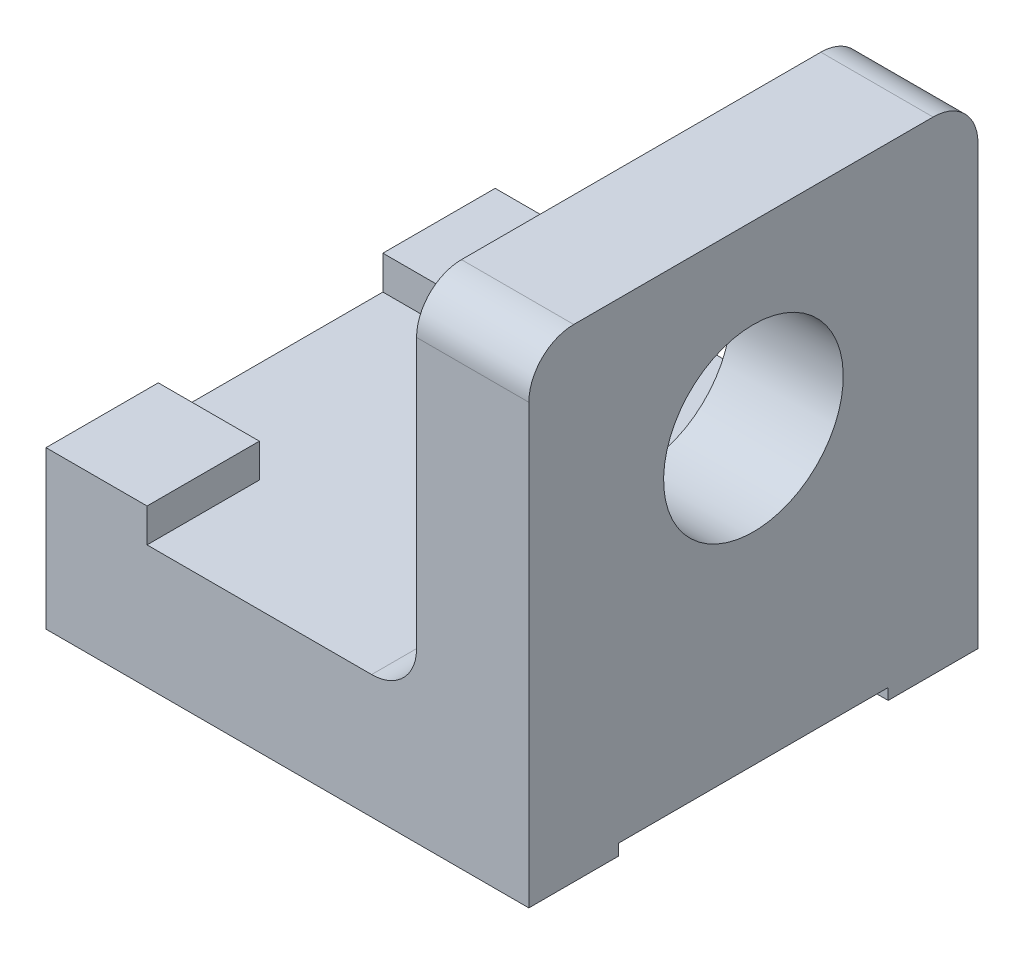
ISO-10303-21;
HEADER;
FILE_DESCRIPTION(('STEP AP214'),'2;1');
FILE_NAME('part.step','',(''),(''),'','','');
FILE_SCHEMA(('AUTOMOTIVE_DESIGN { 1 0 10303 214 1 1 1 1 }'));
ENDSEC;
DATA;
#1=APPLICATION_CONTEXT('core data for automotive mechanical design processes');
#2=APPLICATION_PROTOCOL_DEFINITION('international standard','automotive_design',2000,#1);
#3=PRODUCT_CONTEXT('',#1,'mechanical');
#4=PRODUCT('Part','Part','',(#3));
#5=PRODUCT_RELATED_PRODUCT_CATEGORY('part','',(#4));
#6=PRODUCT_DEFINITION_FORMATION('','',#4);
#7=PRODUCT_DEFINITION_CONTEXT('part definition',#1,'design');
#8=PRODUCT_DEFINITION('design','',#6,#7);
#9=PRODUCT_DEFINITION_SHAPE('','',#8);
#10=(LENGTH_UNIT() NAMED_UNIT(*) SI_UNIT(.MILLI.,.METRE.));
#11=(NAMED_UNIT(*) PLANE_ANGLE_UNIT() SI_UNIT($,.RADIAN.));
#12=(NAMED_UNIT(*) SI_UNIT($,.STERADIAN.) SOLID_ANGLE_UNIT());
#13=UNCERTAINTY_MEASURE_WITH_UNIT(LENGTH_MEASURE(1.E-05),#10,'distance_accuracy_value','');
#14=(GEOMETRIC_REPRESENTATION_CONTEXT(3) GLOBAL_UNCERTAINTY_ASSIGNED_CONTEXT((#13)) GLOBAL_UNIT_ASSIGNED_CONTEXT((#10,
#11,#12)) REPRESENTATION_CONTEXT('',''));
#15=CARTESIAN_POINT('',(0.,0.,0.));
#16=DIRECTION('',(0.,0.,1.));
#17=DIRECTION('',(1.,0.,0.));
#18=AXIS2_PLACEMENT_3D('',#15,#16,#17);
#19=CARTESIAN_POINT('',(88.34779045378,-23.8125,127.));
#20=DIRECTION('',(-1.,0.,0.));
#21=DIRECTION('',(0.,0.,1.));
#22=AXIS2_PLACEMENT_3D('',#19,#20,#21);
#23=PLANE('',#22);
#24=DIRECTION('',(0.,0.,-1.));
#25=VECTOR('',#24,1.);
#26=CARTESIAN_POINT('',(88.34779045378,-23.8125,127.));
#27=LINE('',#26,#25);
#28=CARTESIAN_POINT('',(88.34779045378,-23.8125,31.75));
#29=VERTEX_POINT('',#28);
#30=CARTESIAN_POINT('',(88.34779045378,-23.8125,0.));
#31=VERTEX_POINT('',#30);
#32=EDGE_CURVE('E329',#29,#31,#27,.T.);
#33=ORIENTED_EDGE('',*,*,#32,.F.);
#34=DIRECTION('',(0.,-1.,0.));
#35=VECTOR('',#34,1.);
#36=CARTESIAN_POINT('',(88.34779045378,-23.8125,31.75));
#37=LINE('',#36,#35);
#38=CARTESIAN_POINT('',(88.34779045378,-33.3374999999999,31.75));
#39=VERTEX_POINT('',#38);
#40=EDGE_CURVE('E216',#29,#39,#37,.T.);
#41=ORIENTED_EDGE('',*,*,#40,.T.);
#42=DIRECTION('',(0.,0.,-1.));
#43=VECTOR('',#42,1.);
#44=CARTESIAN_POINT('',(88.34779045378,-33.3374999999999,127.));
#45=LINE('',#44,#43);
#46=CARTESIAN_POINT('',(88.34779045378,-33.3374999999999,0.));
#47=VERTEX_POINT('',#46);
#48=EDGE_CURVE('E334',#39,#47,#45,.T.);
#49=ORIENTED_EDGE('',*,*,#48,.T.);
#50=DIRECTION('',(0.,1.,0.));
#51=VECTOR('',#50,1.);
#52=CARTESIAN_POINT('',(88.34779045378,-23.8125,0.));
#53=LINE('',#52,#51);
#54=EDGE_CURVE('E296',#47,#31,#53,.T.);
#55=ORIENTED_EDGE('',*,*,#54,.T.);
#56=EDGE_LOOP('',(#33,#41,#49,#55));
#57=FACE_BOUND('',#56,.T.);
#58=ADVANCED_FACE('F39',(#57),#23,.F.);
#59=CARTESIAN_POINT('',(59.7727904537801,-23.8125,127.));
#60=DIRECTION('',(0.,-1.,0.));
#61=DIRECTION('',(0.,0.,-1.));
#62=AXIS2_PLACEMENT_3D('',#59,#60,#61);
#63=PLANE('',#62);
#64=DIRECTION('',(0.,0.,-1.));
#65=VECTOR('',#64,1.);
#66=CARTESIAN_POINT('',(59.7727904537801,-23.8125,127.));
#67=LINE('',#66,#65);
#68=CARTESIAN_POINT('',(59.7727904537801,-23.8125,31.75));
#69=VERTEX_POINT('',#68);
#70=CARTESIAN_POINT('',(59.7727904537801,-23.8125,0.));
#71=VERTEX_POINT('',#70);
#72=EDGE_CURVE('E326',#69,#71,#67,.T.);
#73=ORIENTED_EDGE('',*,*,#72,.F.);
#74=DIRECTION('',(-1.,0.,0.));
#75=VECTOR('',#74,1.);
#76=CARTESIAN_POINT('',(109.81079045378,-23.8125,31.75));
#77=LINE('',#76,#75);
#78=EDGE_CURVE('E209',#29,#69,#77,.T.);
#79=ORIENTED_EDGE('',*,*,#78,.F.);
#80=ORIENTED_EDGE('',*,*,#32,.T.);
#81=DIRECTION('',(-1.,0.,0.));
#82=VECTOR('',#81,1.);
#83=CARTESIAN_POINT('',(59.7727904537801,-23.8125,0.));
#84=LINE('',#83,#82);
#85=EDGE_CURVE('E300',#31,#71,#84,.T.);
#86=ORIENTED_EDGE('',*,*,#85,.T.);
#87=EDGE_LOOP('',(#73,#79,#80,#86));
#88=FACE_BOUND('',#87,.T.);
#89=ADVANCED_FACE('F417',(#88),#63,.F.);
#90=CARTESIAN_POINT('',(196.29779045378,-68.2625,127.));
#91=DIRECTION('',(0.,1.,0.));
#92=DIRECTION('',(-1.,0.,0.));
#93=AXIS2_PLACEMENT_3D('',#90,#91,#92);
#94=PLANE('',#93);
#95=DIRECTION('',(0.,0.,-1.));
#96=VECTOR('',#95,1.);
#97=CARTESIAN_POINT('',(196.29779045378,-68.2625,127.));
#98=LINE('',#97,#96);
#99=CARTESIAN_POINT('',(196.29779045378,-68.2625,25.4));
#100=VERTEX_POINT('',#99);
#101=CARTESIAN_POINT('',(196.29779045378,-68.2625,0.));
#102=VERTEX_POINT('',#101);
#103=EDGE_CURVE('E316',#100,#102,#98,.T.);
#104=ORIENTED_EDGE('',*,*,#103,.F.);
#105=DIRECTION('',(-1.,0.,0.));
#106=VECTOR('',#105,1.);
#107=CARTESIAN_POINT('',(196.29779045378,-68.2625,25.4));
#108=LINE('',#107,#106);
#109=CARTESIAN_POINT('',(59.7727904537801,-68.2625,25.4));
#110=VERTEX_POINT('',#109);
#111=EDGE_CURVE('E234',#100,#110,#108,.T.);
#112=ORIENTED_EDGE('',*,*,#111,.T.);
#113=DIRECTION('',(0.,0.,-1.));
#114=VECTOR('',#113,1.);
#115=CARTESIAN_POINT('',(59.7727904537801,-68.2625,127.));
#116=LINE('',#115,#114);
#117=CARTESIAN_POINT('',(59.7727904537801,-68.2625,0.));
#118=VERTEX_POINT('',#117);
#119=EDGE_CURVE('E321',#110,#118,#116,.T.);
#120=ORIENTED_EDGE('',*,*,#119,.T.);
#121=DIRECTION('',(1.,0.,0.));
#122=VECTOR('',#121,1.);
#123=CARTESIAN_POINT('',(196.29779045378,-68.2625,0.));
#124=LINE('',#123,#122);
#125=EDGE_CURVE('E308',#118,#102,#124,.T.);
#126=ORIENTED_EDGE('',*,*,#125,.T.);
#127=EDGE_LOOP('',(#104,#112,#120,#126));
#128=FACE_BOUND('',#127,.T.);
#129=ADVANCED_FACE('F423',(#128),#94,.F.);
#130=CARTESIAN_POINT('',(196.29779045378,68.2625,127.));
#131=DIRECTION('',(0.,-1.,0.));
#132=DIRECTION('',(1.,0.,0.));
#133=AXIS2_PLACEMENT_3D('',#130,#131,#132);
#134=PLANE('',#133);
#135=DIRECTION('',(0.,0.,-1.));
#136=VECTOR('',#135,1.);
#137=CARTESIAN_POINT('',(164.54779045378,68.2625,127.));
#138=LINE('',#137,#136);
#139=CARTESIAN_POINT('',(164.54779045378,68.2625,114.3));
#140=VERTEX_POINT('',#139);
#141=CARTESIAN_POINT('',(164.54779045378,68.2625,12.7));
#142=VERTEX_POINT('',#141);
#143=EDGE_CURVE('E338',#140,#142,#138,.T.);
#144=ORIENTED_EDGE('',*,*,#143,.F.);
#145=DIRECTION('',(-1.,0.,0.));
#146=VECTOR('',#145,1.);
#147=CARTESIAN_POINT('',(196.29779045378,68.2625,114.3));
#148=LINE('',#147,#146);
#149=CARTESIAN_POINT('',(196.29779045378,68.2625,114.3));
#150=VERTEX_POINT('',#149);
#151=EDGE_CURVE('E363',#140,#150,#148,.F.);
#152=ORIENTED_EDGE('',*,*,#151,.T.);
#153=DIRECTION('',(0.,0.,-1.));
#154=VECTOR('',#153,1.);
#155=CARTESIAN_POINT('',(196.29779045378,68.2625,127.));
#156=LINE('',#155,#154);
#157=CARTESIAN_POINT('',(196.29779045378,68.2625,12.7));
#158=VERTEX_POINT('',#157);
#159=EDGE_CURVE('E289',#150,#158,#156,.T.);
#160=ORIENTED_EDGE('',*,*,#159,.T.);
#161=DIRECTION('',(-1.,0.,0.));
#162=VECTOR('',#161,1.);
#163=CARTESIAN_POINT('',(164.54779045378,68.2625,12.7));
#164=LINE('',#163,#162);
#165=EDGE_CURVE('E359',#158,#142,#164,.T.);
#166=ORIENTED_EDGE('',*,*,#165,.T.);
#167=EDGE_LOOP('',(#144,#152,#160,#166));
#168=FACE_BOUND('',#167,.T.);
#169=ADVANCED_FACE('F409',(#168),#134,.F.);
#170=CARTESIAN_POINT('',(164.54779045378,-33.3374999999999,127.));
#171=DIRECTION('',(1.,0.,0.));
#172=DIRECTION('',(0.,0.,-1.));
#173=AXIS2_PLACEMENT_3D('',#170,#171,#172);
#174=PLANE('',#173);
#175=CARTESIAN_POINT('',(164.54779045378,17.4625,63.5));
#176=DIRECTION('',(1.,0.,0.));
#177=DIRECTION('',(0.,0.,-1.));
#178=AXIS2_PLACEMENT_3D('',#175,#176,#177);
#179=CIRCLE('',#178,25.4);
#180=CARTESIAN_POINT('',(164.54779045378,17.4625,38.1));
#181=VERTEX_POINT('',#180);
#182=EDGE_CURVE('E260',#181,#181,#179,.T.);
#183=ORIENTED_EDGE('',*,*,#182,.T.);
#184=EDGE_LOOP('',(#183));
#185=FACE_BOUND('',#184,.T.);
#186=DIRECTION('',(0.,-1.,0.));
#187=VECTOR('',#186,1.);
#188=CARTESIAN_POINT('',(164.54779045378,-33.3374999999999,0.));
#189=LINE('',#188,#187);
#190=CARTESIAN_POINT('',(164.54779045378,55.5625,0.));
#191=VERTEX_POINT('',#190);
#192=CARTESIAN_POINT('',(164.54779045378,-20.6374999999999,0.));
#193=VERTEX_POINT('',#192);
#194=EDGE_CURVE('E264',#191,#193,#189,.T.);
#195=ORIENTED_EDGE('',*,*,#194,.T.);
#196=DIRECTION('',(0.,0.,-1.));
#197=VECTOR('',#196,1.);
#198=CARTESIAN_POINT('',(164.54779045378,-20.6374999999999,127.));
#199=LINE('',#198,#197);
#200=CARTESIAN_POINT('',(164.54779045378,-20.6374999999999,127.));
#201=VERTEX_POINT('',#200);
#202=EDGE_CURVE('E352',#193,#201,#199,.F.);
#203=ORIENTED_EDGE('',*,*,#202,.T.);
#204=DIRECTION('',(0.,-1.,0.));
#205=VECTOR('',#204,1.);
#206=CARTESIAN_POINT('',(164.54779045378,-33.3374999999999,127.));
#207=LINE('',#206,#205);
#208=CARTESIAN_POINT('',(164.54779045378,55.5625,127.));
#209=VERTEX_POINT('',#208);
#210=EDGE_CURVE('E265',#209,#201,#207,.T.);
#211=ORIENTED_EDGE('',*,*,#210,.F.);
#212=CARTESIAN_POINT('',(164.54779045378,55.5625,114.3));
#213=DIRECTION('',(1.,0.,0.));
#214=DIRECTION('',(0.,0.,-1.));
#215=AXIS2_PLACEMENT_3D('',#212,#213,#214);
#216=CIRCLE('',#215,12.7);
#217=EDGE_CURVE('E349',#209,#140,#216,.F.);
#218=ORIENTED_EDGE('',*,*,#217,.T.);
#219=ORIENTED_EDGE('',*,*,#143,.T.);
#220=CARTESIAN_POINT('',(164.54779045378,55.5625,12.7));
#221=DIRECTION('',(1.,0.,0.));
#222=DIRECTION('',(0.,0.,-1.));
#223=AXIS2_PLACEMENT_3D('',#220,#221,#222);
#224=CIRCLE('',#223,12.7);
#225=EDGE_CURVE('E346',#142,#191,#224,.F.);
#226=ORIENTED_EDGE('',*,*,#225,.T.);
#227=EDGE_LOOP('',(#195,#203,#211,#218,#219,#226));
#228=FACE_BOUND('',#227,.T.);
#229=ADVANCED_FACE('F380',(#185,#228),#174,.F.);
#230=CARTESIAN_POINT('',(88.34779045378,-33.3374999999999,127.));
#231=DIRECTION('',(0.,-1.,0.));
#232=DIRECTION('',(0.,0.,-1.));
#233=AXIS2_PLACEMENT_3D('',#230,#231,#232);
#234=PLANE('',#233);
#235=DIRECTION('',(-1.,0.,0.));
#236=VECTOR('',#235,1.);
#237=CARTESIAN_POINT('',(88.34779045378,-33.3374999999999,127.));
#238=LINE('',#237,#236);
#239=CARTESIAN_POINT('',(151.84779045378,-33.3374999999999,127.));
#240=VERTEX_POINT('',#239);
#241=CARTESIAN_POINT('',(88.34779045378,-33.3374999999999,127.));
#242=VERTEX_POINT('',#241);
#243=EDGE_CURVE('E269',#240,#242,#238,.T.);
#244=ORIENTED_EDGE('',*,*,#243,.F.);
#245=DIRECTION('',(0.,0.,-1.));
#246=VECTOR('',#245,1.);
#247=CARTESIAN_POINT('',(151.84779045378,-33.3374999999999,0.));
#248=LINE('',#247,#246);
#249=CARTESIAN_POINT('',(151.84779045378,-33.3374999999999,0.));
#250=VERTEX_POINT('',#249);
#251=EDGE_CURVE('E342',#240,#250,#248,.T.);
#252=ORIENTED_EDGE('',*,*,#251,.T.);
#253=DIRECTION('',(-1.,0.,0.));
#254=VECTOR('',#253,1.);
#255=CARTESIAN_POINT('',(88.34779045378,-33.3374999999999,0.));
#256=LINE('',#255,#254);
#257=EDGE_CURVE('E293',#250,#47,#256,.T.);
#258=ORIENTED_EDGE('',*,*,#257,.T.);
#259=ORIENTED_EDGE('',*,*,#48,.F.);
#260=DIRECTION('',(-1.,0.,0.));
#261=VECTOR('',#260,1.);
#262=CARTESIAN_POINT('',(109.81079045378,-33.3374999999999,31.75));
#263=LINE('',#262,#261);
#264=CARTESIAN_POINT('',(59.7727904537801,-33.3374999999999,31.75));
#265=VERTEX_POINT('',#264);
#266=EDGE_CURVE('E185',#39,#265,#263,.T.);
#267=ORIENTED_EDGE('',*,*,#266,.T.);
#268=DIRECTION('',(0.,0.,1.));
#269=VECTOR('',#268,1.);
#270=CARTESIAN_POINT('',(59.7727904537801,-33.3374999999999,31.75));
#271=LINE('',#270,#269);
#272=CARTESIAN_POINT('',(59.7727904537801,-33.3375,95.25));
#273=VERTEX_POINT('',#272);
#274=EDGE_CURVE('E189',#265,#273,#271,.T.);
#275=ORIENTED_EDGE('',*,*,#274,.T.);
#276=DIRECTION('',(-1.,0.,0.));
#277=VECTOR('',#276,1.);
#278=CARTESIAN_POINT('',(109.81079045378,-33.3375,95.25));
#279=LINE('',#278,#277);
#280=CARTESIAN_POINT('',(88.34779045378,-33.3375,95.25));
#281=VERTEX_POINT('',#280);
#282=EDGE_CURVE('E172',#281,#273,#279,.T.);
#283=ORIENTED_EDGE('',*,*,#282,.F.);
#284=EDGE_CURVE('E335',#242,#281,#45,.T.);
#285=ORIENTED_EDGE('',*,*,#284,.F.);
#286=EDGE_LOOP('',(#244,#252,#258,#259,#267,#275,#283,#285));
#287=FACE_BOUND('',#286,.T.);
#288=ADVANCED_FACE('F191',(#287),#234,.F.);
#289=ORIENTED_EDGE('',*,*,#284,.T.);
#290=DIRECTION('',(0.,1.,0.));
#291=VECTOR('',#290,1.);
#292=CARTESIAN_POINT('',(88.34779045378,-23.8125,95.25));
#293=LINE('',#292,#291);
#294=CARTESIAN_POINT('',(88.34779045378,-23.8125,95.25));
#295=VERTEX_POINT('',#294);
#296=EDGE_CURVE('E179',#281,#295,#293,.T.);
#297=ORIENTED_EDGE('',*,*,#296,.T.);
#298=CARTESIAN_POINT('',(88.34779045378,-23.8125,127.));
#299=VERTEX_POINT('',#298);
#300=EDGE_CURVE('E330',#299,#295,#27,.T.);
#301=ORIENTED_EDGE('',*,*,#300,.F.);
#302=DIRECTION('',(0.,1.,0.));
#303=VECTOR('',#302,1.);
#304=CARTESIAN_POINT('',(88.34779045378,-23.8125,127.));
#305=LINE('',#304,#303);
#306=EDGE_CURVE('E273',#242,#299,#305,.T.);
#307=ORIENTED_EDGE('',*,*,#306,.F.);
#308=EDGE_LOOP('',(#289,#297,#301,#307));
#309=FACE_BOUND('',#308,.T.);
#310=ADVANCED_FACE('F389',(#309),#23,.F.);
#311=ORIENTED_EDGE('',*,*,#300,.T.);
#312=DIRECTION('',(-1.,0.,0.));
#313=VECTOR('',#312,1.);
#314=CARTESIAN_POINT('',(109.81079045378,-23.8125,95.25));
#315=LINE('',#314,#313);
#316=CARTESIAN_POINT('',(59.7727904537801,-23.8125,95.25));
#317=VERTEX_POINT('',#316);
#318=EDGE_CURVE('E184',#295,#317,#315,.T.);
#319=ORIENTED_EDGE('',*,*,#318,.T.);
#320=CARTESIAN_POINT('',(59.7727904537801,-23.8125,127.));
#321=VERTEX_POINT('',#320);
#322=EDGE_CURVE('E202',#321,#317,#67,.T.);
#323=ORIENTED_EDGE('',*,*,#322,.F.);
#324=DIRECTION('',(-1.,0.,0.));
#325=VECTOR('',#324,1.);
#326=CARTESIAN_POINT('',(59.7727904537801,-23.8125,127.));
#327=LINE('',#326,#325);
#328=EDGE_CURVE('E276',#299,#321,#327,.T.);
#329=ORIENTED_EDGE('',*,*,#328,.F.);
#330=EDGE_LOOP('',(#311,#319,#323,#329));
#331=FACE_BOUND('',#330,.T.);
#332=ADVANCED_FACE('F393',(#331),#63,.F.);
#333=CARTESIAN_POINT('',(59.7727904537801,-68.2625,127.));
#334=DIRECTION('',(1.,0.,0.));
#335=DIRECTION('',(0.,0.,-1.));
#336=AXIS2_PLACEMENT_3D('',#333,#334,#335);
#337=PLANE('',#336);
#338=ORIENTED_EDGE('',*,*,#274,.F.);
#339=DIRECTION('',(0.,-1.,0.));
#340=VECTOR('',#339,1.);
#341=CARTESIAN_POINT('',(59.7727904537801,-23.8125,31.75));
#342=LINE('',#341,#340);
#343=EDGE_CURVE('E196',#69,#265,#342,.T.);
#344=ORIENTED_EDGE('',*,*,#343,.F.);
#345=ORIENTED_EDGE('',*,*,#72,.T.);
#346=DIRECTION('',(0.,-1.,0.));
#347=VECTOR('',#346,1.);
#348=CARTESIAN_POINT('',(59.7727904537801,-68.2625,0.));
#349=LINE('',#348,#347);
#350=EDGE_CURVE('E304',#71,#118,#349,.T.);
#351=ORIENTED_EDGE('',*,*,#350,.T.);
#352=ORIENTED_EDGE('',*,*,#119,.F.);
#353=DIRECTION('',(0.,-1.,0.));
#354=VECTOR('',#353,1.);
#355=CARTESIAN_POINT('',(59.7727904537801,-68.2625,25.4));
#356=LINE('',#355,#354);
#357=CARTESIAN_POINT('',(59.7727904537801,-65.0875,25.4));
#358=VERTEX_POINT('',#357);
#359=EDGE_CURVE('E220',#358,#110,#356,.T.);
#360=ORIENTED_EDGE('',*,*,#359,.F.);
#361=DIRECTION('',(0.,0.,-1.));
#362=VECTOR('',#361,1.);
#363=CARTESIAN_POINT('',(59.7727904537801,-65.0875,25.4));
#364=LINE('',#363,#362);
#365=CARTESIAN_POINT('',(59.7727904537801,-65.0875,101.6));
#366=VERTEX_POINT('',#365);
#367=EDGE_CURVE('E226',#366,#358,#364,.T.);
#368=ORIENTED_EDGE('',*,*,#367,.F.);
#369=DIRECTION('',(0.,1.,0.));
#370=VECTOR('',#369,1.);
#371=CARTESIAN_POINT('',(59.7727904537801,-68.2625,101.6));
#372=LINE('',#371,#370);
#373=CARTESIAN_POINT('',(59.7727904537801,-68.2625,101.6));
#374=VERTEX_POINT('',#373);
#375=EDGE_CURVE('E237',#374,#366,#372,.T.);
#376=ORIENTED_EDGE('',*,*,#375,.F.);
#377=CARTESIAN_POINT('',(59.7727904537801,-68.2625,127.));
#378=VERTEX_POINT('',#377);
#379=EDGE_CURVE('E322',#378,#374,#116,.T.);
#380=ORIENTED_EDGE('',*,*,#379,.F.);
#381=DIRECTION('',(0.,-1.,0.));
#382=VECTOR('',#381,1.);
#383=CARTESIAN_POINT('',(59.7727904537801,-68.2625,127.));
#384=LINE('',#383,#382);
#385=EDGE_CURVE('E279',#321,#378,#384,.T.);
#386=ORIENTED_EDGE('',*,*,#385,.F.);
#387=ORIENTED_EDGE('',*,*,#322,.T.);
#388=DIRECTION('',(0.,1.,0.));
#389=VECTOR('',#388,1.);
#390=CARTESIAN_POINT('',(59.7727904537801,-23.8125,95.25));
#391=LINE('',#390,#389);
#392=EDGE_CURVE('E176',#273,#317,#391,.T.);
#393=ORIENTED_EDGE('',*,*,#392,.F.);
#394=EDGE_LOOP('',(#338,#344,#345,#351,#352,#360,#368,#376,#380,#386,#387,#393));
#395=FACE_BOUND('',#394,.T.);
#396=ADVANCED_FACE('F199',(#395),#337,.F.);
#397=ORIENTED_EDGE('',*,*,#379,.T.);
#398=DIRECTION('',(-1.,0.,0.));
#399=VECTOR('',#398,1.);
#400=CARTESIAN_POINT('',(196.29779045378,-68.2625,101.6));
#401=LINE('',#400,#399);
#402=CARTESIAN_POINT('',(196.29779045378,-68.2625,101.6));
#403=VERTEX_POINT('',#402);
#404=EDGE_CURVE('E251',#403,#374,#401,.T.);
#405=ORIENTED_EDGE('',*,*,#404,.F.);
#406=CARTESIAN_POINT('',(196.29779045378,-68.2625,127.));
#407=VERTEX_POINT('',#406);
#408=EDGE_CURVE('E317',#407,#403,#98,.T.);
#409=ORIENTED_EDGE('',*,*,#408,.F.);
#410=DIRECTION('',(1.,0.,0.));
#411=VECTOR('',#410,1.);
#412=CARTESIAN_POINT('',(196.29779045378,-68.2625,127.));
#413=LINE('',#412,#411);
#414=EDGE_CURVE('E282',#378,#407,#413,.T.);
#415=ORIENTED_EDGE('',*,*,#414,.F.);
#416=EDGE_LOOP('',(#397,#405,#409,#415));
#417=FACE_BOUND('',#416,.T.);
#418=ADVANCED_FACE('F400',(#417),#94,.F.);
#419=CARTESIAN_POINT('',(196.29779045378,68.2625,127.));
#420=DIRECTION('',(-1.,0.,0.));
#421=DIRECTION('',(0.,-1.,0.));
#422=AXIS2_PLACEMENT_3D('',#419,#420,#421);
#423=PLANE('',#422);
#424=CARTESIAN_POINT('',(196.29779045378,17.4625,63.5));
#425=DIRECTION('',(1.,0.,0.));
#426=DIRECTION('',(0.,1.,0.));
#427=AXIS2_PLACEMENT_3D('',#424,#425,#426);
#428=CIRCLE('',#427,25.4);
#429=CARTESIAN_POINT('',(196.29779045378,42.8625,63.5));
#430=VERTEX_POINT('',#429);
#431=EDGE_CURVE('E247',#430,#430,#428,.T.);
#432=ORIENTED_EDGE('',*,*,#431,.F.);
#433=EDGE_LOOP('',(#432));
#434=FACE_BOUND('',#433,.T.);
#435=ORIENTED_EDGE('',*,*,#159,.F.);
#436=CARTESIAN_POINT('',(196.29779045378,55.5625,114.3));
#437=DIRECTION('',(-1.,0.,0.));
#438=DIRECTION('',(0.,-1.,0.));
#439=AXIS2_PLACEMENT_3D('',#436,#437,#438);
#440=CIRCLE('',#439,12.7);
#441=CARTESIAN_POINT('',(196.29779045378,55.5625,127.));
#442=VERTEX_POINT('',#441);
#443=EDGE_CURVE('E368',#150,#442,#440,.F.);
#444=ORIENTED_EDGE('',*,*,#443,.T.);
#445=DIRECTION('',(0.,1.,0.));
#446=VECTOR('',#445,1.);
#447=CARTESIAN_POINT('',(196.29779045378,68.2625,127.));
#448=LINE('',#447,#446);
#449=EDGE_CURVE('E285',#407,#442,#448,.T.);
#450=ORIENTED_EDGE('',*,*,#449,.F.);
#451=ORIENTED_EDGE('',*,*,#408,.T.);
#452=DIRECTION('',(0.,1.,0.));
#453=VECTOR('',#452,1.);
#454=CARTESIAN_POINT('',(196.29779045378,-68.2625,101.6));
#455=LINE('',#454,#453);
#456=CARTESIAN_POINT('',(196.29779045378,-65.0875,101.6));
#457=VERTEX_POINT('',#456);
#458=EDGE_CURVE('E225',#403,#457,#455,.T.);
#459=ORIENTED_EDGE('',*,*,#458,.T.);
#460=DIRECTION('',(0.,0.,-1.));
#461=VECTOR('',#460,1.);
#462=CARTESIAN_POINT('',(196.29779045378,-65.0875,25.4));
#463=LINE('',#462,#461);
#464=CARTESIAN_POINT('',(196.29779045378,-65.0875,25.4));
#465=VERTEX_POINT('',#464);
#466=EDGE_CURVE('E230',#457,#465,#463,.T.);
#467=ORIENTED_EDGE('',*,*,#466,.T.);
#468=DIRECTION('',(0.,-1.,0.));
#469=VECTOR('',#468,1.);
#470=CARTESIAN_POINT('',(196.29779045378,-68.2625,25.4));
#471=LINE('',#470,#469);
#472=EDGE_CURVE('E221',#465,#100,#471,.T.);
#473=ORIENTED_EDGE('',*,*,#472,.T.);
#474=ORIENTED_EDGE('',*,*,#103,.T.);
#475=DIRECTION('',(0.,1.,0.));
#476=VECTOR('',#475,1.);
#477=CARTESIAN_POINT('',(196.29779045378,68.2625,0.));
#478=LINE('',#477,#476);
#479=CARTESIAN_POINT('',(196.29779045378,55.5625,0.));
#480=VERTEX_POINT('',#479);
#481=EDGE_CURVE('E270',#102,#480,#478,.T.);
#482=ORIENTED_EDGE('',*,*,#481,.T.);
#483=CARTESIAN_POINT('',(196.29779045378,55.5625,12.7));
#484=DIRECTION('',(-1.,0.,0.));
#485=DIRECTION('',(0.,-1.,0.));
#486=AXIS2_PLACEMENT_3D('',#483,#484,#485);
#487=CIRCLE('',#486,12.7);
#488=EDGE_CURVE('E62',#480,#158,#487,.F.);
#489=ORIENTED_EDGE('',*,*,#488,.T.);
#490=EDGE_LOOP('',(#435,#444,#450,#451,#459,#467,#473,#474,#482,#489));
#491=FACE_BOUND('',#490,.T.);
#492=ADVANCED_FACE('F471',(#434,#491),#423,.F.);
#493=CARTESIAN_POINT('',(0.,0.,127.));
#494=DIRECTION('',(0.,0.,-1.));
#495=DIRECTION('',(-1.,0.,0.));
#496=AXIS2_PLACEMENT_3D('',#493,#494,#495);
#497=PLANE('',#496);
#498=ORIENTED_EDGE('',*,*,#449,.T.);
#499=DIRECTION('',(-1.,0.,0.));
#500=VECTOR('',#499,1.);
#501=CARTESIAN_POINT('',(0.,55.5625000000003,127.));
#502=LINE('',#501,#500);
#503=EDGE_CURVE('E355',#442,#209,#502,.T.);
#504=ORIENTED_EDGE('',*,*,#503,.T.);
#505=ORIENTED_EDGE('',*,*,#210,.T.);
#506=CARTESIAN_POINT('',(151.84779045378,-20.6374999999999,127.));
#507=DIRECTION('',(0.,0.,-1.));
#508=DIRECTION('',(-1.,0.,0.));
#509=AXIS2_PLACEMENT_3D('',#506,#507,#508);
#510=CIRCLE('',#509,12.7);
#511=EDGE_CURVE('E11',#201,#240,#510,.T.);
#512=ORIENTED_EDGE('',*,*,#511,.T.);
#513=ORIENTED_EDGE('',*,*,#243,.T.);
#514=ORIENTED_EDGE('',*,*,#306,.T.);
#515=ORIENTED_EDGE('',*,*,#328,.T.);
#516=ORIENTED_EDGE('',*,*,#385,.T.);
#517=ORIENTED_EDGE('',*,*,#414,.T.);
#518=EDGE_LOOP('',(#498,#504,#505,#512,#513,#514,#515,#516,#517));
#519=FACE_BOUND('',#518,.T.);
#520=ADVANCED_FACE('F385',(#519),#497,.F.);
#521=CARTESIAN_POINT('',(0.,0.,0.));
#522=DIRECTION('',(0.,0.,-1.));
#523=DIRECTION('',(-1.,0.,0.));
#524=AXIS2_PLACEMENT_3D('',#521,#522,#523);
#525=PLANE('',#524);
#526=ORIENTED_EDGE('',*,*,#194,.F.);
#527=DIRECTION('',(-1.,0.,0.));
#528=VECTOR('',#527,1.);
#529=CARTESIAN_POINT('',(196.29779045378,55.5625,0.));
#530=LINE('',#529,#528);
#531=EDGE_CURVE('E55',#191,#480,#530,.F.);
#532=ORIENTED_EDGE('',*,*,#531,.T.);
#533=ORIENTED_EDGE('',*,*,#481,.F.);
#534=ORIENTED_EDGE('',*,*,#125,.F.);
#535=ORIENTED_EDGE('',*,*,#350,.F.);
#536=ORIENTED_EDGE('',*,*,#85,.F.);
#537=ORIENTED_EDGE('',*,*,#54,.F.);
#538=ORIENTED_EDGE('',*,*,#257,.F.);
#539=CARTESIAN_POINT('',(151.84779045378,-20.6374999999999,0.));
#540=DIRECTION('',(0.,0.,-1.));
#541=DIRECTION('',(-1.,0.,0.));
#542=AXIS2_PLACEMENT_3D('',#539,#540,#541);
#543=CIRCLE('',#542,12.7);
#544=EDGE_CURVE('E48',#250,#193,#543,.F.);
#545=ORIENTED_EDGE('',*,*,#544,.T.);
#546=EDGE_LOOP('',(#526,#532,#533,#534,#535,#536,#537,#538,#545));
#547=FACE_BOUND('',#546,.T.);
#548=ADVANCED_FACE('F374',(#547),#525,.T.);
#549=CARTESIAN_POINT('',(69.29779045378,17.4625,63.5));
#550=DIRECTION('',(1.,0.,0.));
#551=DIRECTION('',(0.,1.,0.));
#552=AXIS2_PLACEMENT_3D('',#549,#550,#551);
#553=CYLINDRICAL_SURFACE('',#552,25.4);
#554=ORIENTED_EDGE('',*,*,#431,.T.);
#555=EDGE_LOOP('',(#554));
#556=FACE_BOUND('',#555,.T.);
#557=ORIENTED_EDGE('',*,*,#182,.F.);
#558=EDGE_LOOP('',(#557));
#559=FACE_BOUND('',#558,.T.);
#560=ADVANCED_FACE('F464',(#556,#559),#553,.F.);
#561=CARTESIAN_POINT('',(196.29779045378,-68.2625,25.4));
#562=DIRECTION('',(0.,0.,-1.));
#563=DIRECTION('',(0.,1.,0.));
#564=AXIS2_PLACEMENT_3D('',#561,#562,#563);
#565=PLANE('',#564);
#566=ORIENTED_EDGE('',*,*,#359,.T.);
#567=ORIENTED_EDGE('',*,*,#111,.F.);
#568=ORIENTED_EDGE('',*,*,#472,.F.);
#569=DIRECTION('',(-1.,0.,0.));
#570=VECTOR('',#569,1.);
#571=CARTESIAN_POINT('',(196.29779045378,-65.0875,25.4));
#572=LINE('',#571,#570);
#573=EDGE_CURVE('E244',#465,#358,#572,.T.);
#574=ORIENTED_EDGE('',*,*,#573,.T.);
#575=EDGE_LOOP('',(#566,#567,#568,#574));
#576=FACE_BOUND('',#575,.T.);
#577=ADVANCED_FACE('F457',(#576),#565,.F.);
#578=CARTESIAN_POINT('',(196.29779045378,-65.0875,25.4));
#579=DIRECTION('',(0.,1.,0.));
#580=DIRECTION('',(0.,0.,1.));
#581=AXIS2_PLACEMENT_3D('',#578,#579,#580);
#582=PLANE('',#581);
#583=ORIENTED_EDGE('',*,*,#367,.T.);
#584=ORIENTED_EDGE('',*,*,#573,.F.);
#585=ORIENTED_EDGE('',*,*,#466,.F.);
#586=DIRECTION('',(-1.,0.,0.));
#587=VECTOR('',#586,1.);
#588=CARTESIAN_POINT('',(196.29779045378,-65.0875,101.6));
#589=LINE('',#588,#587);
#590=EDGE_CURVE('E248',#457,#366,#589,.T.);
#591=ORIENTED_EDGE('',*,*,#590,.T.);
#592=EDGE_LOOP('',(#583,#584,#585,#591));
#593=FACE_BOUND('',#592,.T.);
#594=ADVANCED_FACE('F454',(#593),#582,.F.);
#595=CARTESIAN_POINT('',(196.29779045378,-68.2625,101.6));
#596=DIRECTION('',(0.,0.,1.));
#597=DIRECTION('',(1.,0.,0.));
#598=AXIS2_PLACEMENT_3D('',#595,#596,#597);
#599=PLANE('',#598);
#600=ORIENTED_EDGE('',*,*,#375,.T.);
#601=ORIENTED_EDGE('',*,*,#590,.F.);
#602=ORIENTED_EDGE('',*,*,#458,.F.);
#603=ORIENTED_EDGE('',*,*,#404,.T.);
#604=EDGE_LOOP('',(#600,#601,#602,#603));
#605=FACE_BOUND('',#604,.T.);
#606=ADVANCED_FACE('F450',(#605),#599,.F.);
#607=CARTESIAN_POINT('',(109.81079045378,-23.8125,31.75));
#608=DIRECTION('',(0.,0.,-1.));
#609=DIRECTION('',(-1.,0.,0.));
#610=AXIS2_PLACEMENT_3D('',#607,#608,#609);
#611=PLANE('',#610);
#612=ORIENTED_EDGE('',*,*,#78,.T.);
#613=ORIENTED_EDGE('',*,*,#343,.T.);
#614=ORIENTED_EDGE('',*,*,#266,.F.);
#615=ORIENTED_EDGE('',*,*,#40,.F.);
#616=EDGE_LOOP('',(#612,#613,#614,#615));
#617=FACE_BOUND('',#616,.T.);
#618=ADVANCED_FACE('F445',(#617),#611,.F.);
#619=CARTESIAN_POINT('',(109.81079045378,-23.8125,95.25));
#620=DIRECTION('',(0.,0.,1.));
#621=DIRECTION('',(1.,0.,0.));
#622=AXIS2_PLACEMENT_3D('',#619,#620,#621);
#623=PLANE('',#622);
#624=ORIENTED_EDGE('',*,*,#282,.T.);
#625=ORIENTED_EDGE('',*,*,#392,.T.);
#626=ORIENTED_EDGE('',*,*,#318,.F.);
#627=ORIENTED_EDGE('',*,*,#296,.F.);
#628=EDGE_LOOP('',(#624,#625,#626,#627));
#629=FACE_BOUND('',#628,.T.);
#630=ADVANCED_FACE('F174',(#629),#623,.F.);
#631=CARTESIAN_POINT('',(151.84779045378,-20.6374999999999,127.));
#632=DIRECTION('',(0.,0.,1.));
#633=DIRECTION('',(1.,0.,0.));
#634=AXIS2_PLACEMENT_3D('',#631,#632,#633);
#635=CYLINDRICAL_SURFACE('',#634,12.7);
#636=ORIENTED_EDGE('',*,*,#511,.F.);
#637=ORIENTED_EDGE('',*,*,#202,.F.);
#638=ORIENTED_EDGE('',*,*,#544,.F.);
#639=ORIENTED_EDGE('',*,*,#251,.F.);
#640=EDGE_LOOP('',(#636,#637,#638,#639));
#641=FACE_BOUND('',#640,.T.);
#642=ADVANCED_FACE('F383',(#641),#635,.F.);
#643=CARTESIAN_POINT('',(0.,55.5625000000003,114.3));
#644=DIRECTION('',(-1.,0.,0.));
#645=DIRECTION('',(0.,-1.,0.));
#646=AXIS2_PLACEMENT_3D('',#643,#644,#645);
#647=CYLINDRICAL_SURFACE('',#646,12.7);
#648=ORIENTED_EDGE('',*,*,#443,.F.);
#649=ORIENTED_EDGE('',*,*,#151,.F.);
#650=ORIENTED_EDGE('',*,*,#217,.F.);
#651=ORIENTED_EDGE('',*,*,#503,.F.);
#652=EDGE_LOOP('',(#648,#649,#650,#651));
#653=FACE_BOUND('',#652,.T.);
#654=ADVANCED_FACE('F405',(#653),#647,.T.);
#655=CARTESIAN_POINT('',(196.29779045378,55.5625,12.7));
#656=DIRECTION('',(1.,0.,0.));
#657=DIRECTION('',(0.,1.,0.));
#658=AXIS2_PLACEMENT_3D('',#655,#656,#657);
#659=CYLINDRICAL_SURFACE('',#658,12.7);
#660=ORIENTED_EDGE('',*,*,#488,.F.);
#661=ORIENTED_EDGE('',*,*,#531,.F.);
#662=ORIENTED_EDGE('',*,*,#225,.F.);
#663=ORIENTED_EDGE('',*,*,#165,.F.);
#664=EDGE_LOOP('',(#660,#661,#662,#663));
#665=FACE_BOUND('',#664,.T.);
#666=ADVANCED_FACE('F41',(#665),#659,.T.);
#667=CLOSED_SHELL('',(#58,#89,#129,#169,#229,#288,#310,#332,#396,#418,#492,#520,#548,#560,#577,
#594,#606,#618,#630,#642,#654,#666));
#668=MANIFOLD_SOLID_BREP('B2',#667);
#669=ADVANCED_BREP_SHAPE_REPRESENTATION('',(#18,#668),#14);
#670=SHAPE_DEFINITION_REPRESENTATION(#9,#669);
ENDSEC;
END-ISO-10303-21;
